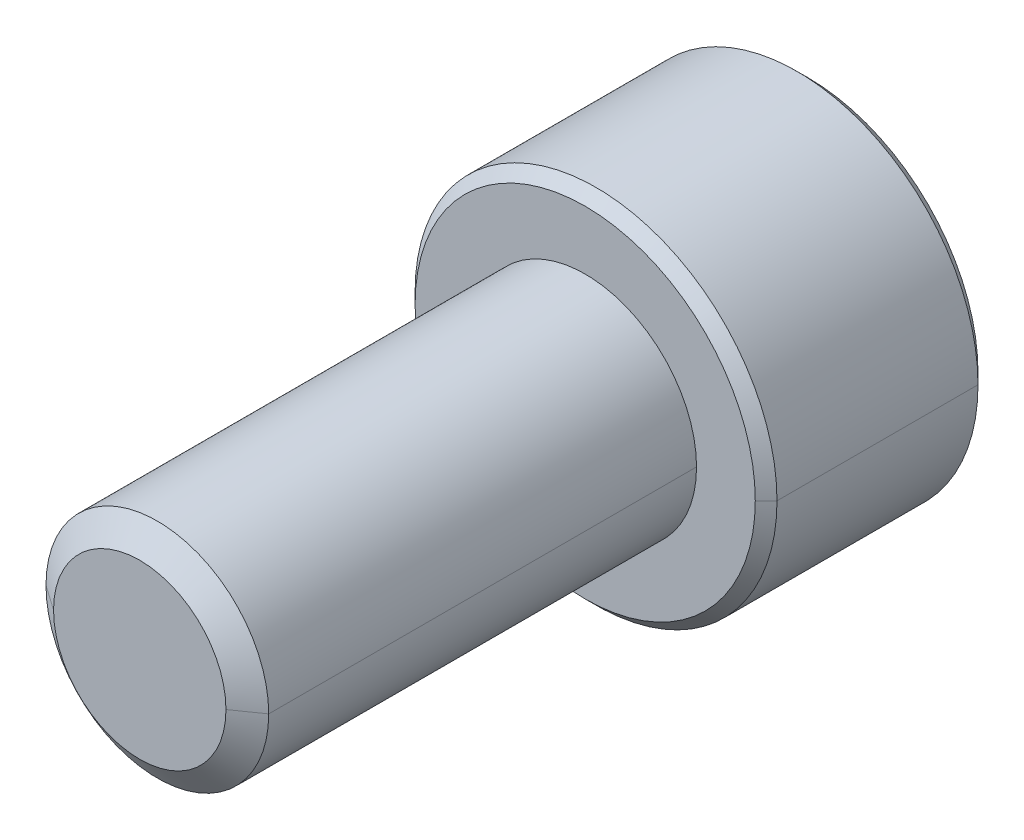
ISO-10303-21;
HEADER;
FILE_DESCRIPTION(('STEP AP214'),'2;1');
FILE_NAME('part.step','',(''),(''),'','','');
FILE_SCHEMA(('AUTOMOTIVE_DESIGN { 1 0 10303 214 1 1 1 1 }'));
ENDSEC;
DATA;
#1=APPLICATION_CONTEXT('core data for automotive mechanical design processes');
#2=APPLICATION_PROTOCOL_DEFINITION('international standard','automotive_design',2000,#1);
#3=PRODUCT_CONTEXT('',#1,'mechanical');
#4=PRODUCT('Part','Part','',(#3));
#5=PRODUCT_RELATED_PRODUCT_CATEGORY('part','',(#4));
#6=PRODUCT_DEFINITION_FORMATION('','',#4);
#7=PRODUCT_DEFINITION_CONTEXT('part definition',#1,'design');
#8=PRODUCT_DEFINITION('design','',#6,#7);
#9=PRODUCT_DEFINITION_SHAPE('','',#8);
#10=(LENGTH_UNIT() NAMED_UNIT(*) SI_UNIT(.MILLI.,.METRE.));
#11=(NAMED_UNIT(*) PLANE_ANGLE_UNIT() SI_UNIT($,.RADIAN.));
#12=(NAMED_UNIT(*) SI_UNIT($,.STERADIAN.) SOLID_ANGLE_UNIT());
#13=UNCERTAINTY_MEASURE_WITH_UNIT(LENGTH_MEASURE(1.E-05),#10,'distance_accuracy_value','');
#14=(GEOMETRIC_REPRESENTATION_CONTEXT(3) GLOBAL_UNCERTAINTY_ASSIGNED_CONTEXT((#13)) GLOBAL_UNIT_ASSIGNED_CONTEXT((#10,
#11,#12)) REPRESENTATION_CONTEXT('',''));
#15=CARTESIAN_POINT('',(0.,0.,0.));
#16=DIRECTION('',(0.,0.,1.));
#17=DIRECTION('',(1.,0.,0.));
#18=AXIS2_PLACEMENT_3D('',#15,#16,#17);
#19=CARTESIAN_POINT('',(0.,0.,-16.39));
#20=DIRECTION('',(0.,0.,-1.));
#21=DIRECTION('',(-1.,0.,0.));
#22=AXIS2_PLACEMENT_3D('',#19,#20,#21);
#23=CONICAL_SURFACE('',#22,6.5,0.785398163397445);
#24=CARTESIAN_POINT('',(0.,0.,-16.));
#25=DIRECTION('',(0.,0.,1.));
#26=DIRECTION('',(-1.,0.,0.));
#27=AXIS2_PLACEMENT_3D('',#24,#25,#26);
#28=CIRCLE('',#27,6.11);
#29=CARTESIAN_POINT('',(6.11,0.,-16.));
#30=VERTEX_POINT('',#29);
#31=CARTESIAN_POINT('',(-6.11,0.,-16.));
#32=VERTEX_POINT('',#31);
#33=EDGE_CURVE('E43',#30,#32,#28,.T.);
#34=ORIENTED_EDGE('',*,*,#33,.F.);
#35=DIRECTION('',(0.707106781186545,0.,-0.70710678118655));
#36=VECTOR('',#35,1.);
#37=CARTESIAN_POINT('',(6.5,0.,-16.39));
#38=LINE('',#37,#36);
#39=CARTESIAN_POINT('',(6.5,0.,-16.39));
#40=VERTEX_POINT('',#39);
#41=EDGE_CURVE('E11',#30,#40,#38,.T.);
#42=ORIENTED_EDGE('',*,*,#41,.T.);
#43=CARTESIAN_POINT('',(0.,0.,-16.39));
#44=DIRECTION('',(0.,0.,-1.));
#45=DIRECTION('',(-1.,0.,0.));
#46=AXIS2_PLACEMENT_3D('',#43,#44,#45);
#47=CIRCLE('',#46,6.5);
#48=CARTESIAN_POINT('',(-6.5,0.,-16.39));
#49=VERTEX_POINT('',#48);
#50=EDGE_CURVE('E602',#49,#40,#47,.T.);
#51=ORIENTED_EDGE('',*,*,#50,.F.);
#52=DIRECTION('',(-0.707106781186545,0.,-0.70710678118655));
#53=VECTOR('',#52,1.);
#54=CARTESIAN_POINT('',(-6.5,0.,-16.39));
#55=LINE('',#54,#53);
#56=EDGE_CURVE('E193',#32,#49,#55,.T.);
#57=ORIENTED_EDGE('',*,*,#56,.F.);
#58=EDGE_LOOP('',(#34,#42,#51,#57));
#59=FACE_BOUND('',#58,.T.);
#60=ADVANCED_FACE('F16',(#59),#23,.T.);
#61=CARTESIAN_POINT('',(0.,0.,-24.));
#62=DIRECTION('',(0.,0.,1.));
#63=DIRECTION('',(1.,0.,0.));
#64=AXIS2_PLACEMENT_3D('',#61,#62,#63);
#65=CONICAL_SURFACE('',#64,6.11,0.785398163397449);
#66=CARTESIAN_POINT('',(0.,0.,-24.));
#67=DIRECTION('',(0.,0.,-1.));
#68=DIRECTION('',(-1.,0.,0.));
#69=AXIS2_PLACEMENT_3D('',#66,#67,#68);
#70=CIRCLE('',#69,6.11);
#71=CARTESIAN_POINT('',(-6.11,0.,-24.));
#72=VERTEX_POINT('',#71);
#73=CARTESIAN_POINT('',(6.11,0.,-24.));
#74=VERTEX_POINT('',#73);
#75=EDGE_CURVE('E151',#72,#74,#70,.T.);
#76=ORIENTED_EDGE('',*,*,#75,.F.);
#77=DIRECTION('',(-0.707106781186548,0.,0.707106781186547));
#78=VECTOR('',#77,1.);
#79=CARTESIAN_POINT('',(-6.11,0.,-24.));
#80=LINE('',#79,#78);
#81=CARTESIAN_POINT('',(-6.5,0.,-23.61));
#82=VERTEX_POINT('',#81);
#83=EDGE_CURVE('E29',#72,#82,#80,.T.);
#84=ORIENTED_EDGE('',*,*,#83,.T.);
#85=CARTESIAN_POINT('',(0.,0.,-23.61));
#86=DIRECTION('',(0.,0.,1.));
#87=DIRECTION('',(-1.,0.,0.));
#88=AXIS2_PLACEMENT_3D('',#85,#86,#87);
#89=CIRCLE('',#88,6.5);
#90=CARTESIAN_POINT('',(6.5,0.,-23.61));
#91=VERTEX_POINT('',#90);
#92=EDGE_CURVE('E252',#91,#82,#89,.T.);
#93=ORIENTED_EDGE('',*,*,#92,.F.);
#94=DIRECTION('',(0.707106781186548,0.,0.707106781186547));
#95=VECTOR('',#94,1.);
#96=CARTESIAN_POINT('',(6.11,0.,-24.));
#97=LINE('',#96,#95);
#98=EDGE_CURVE('E156',#74,#91,#97,.T.);
#99=ORIENTED_EDGE('',*,*,#98,.F.);
#100=EDGE_LOOP('',(#76,#84,#93,#99));
#101=FACE_BOUND('',#100,.T.);
#102=ADVANCED_FACE('F153',(#101),#65,.T.);
#103=CARTESIAN_POINT('',(0.,0.,-24.));
#104=DIRECTION('',(0.,0.,-1.));
#105=DIRECTION('',(-1.,0.,0.));
#106=AXIS2_PLACEMENT_3D('',#103,#104,#105);
#107=CONICAL_SURFACE('',#106,3.46410161513775,0.78539816339745);
#108=CARTESIAN_POINT('',(-3.,0.,-23.5358983848622));
#109=CARTESIAN_POINT('',(-3.,0.436270464023545,-23.5358983848622));
#110=CARTESIAN_POINT('',(-3.,0.891919934957485,-23.6656781167882));
#111=CARTESIAN_POINT('',(-3.,1.29040025717897,-23.7791747248051));
#112=CARTESIAN_POINT('',(-3.,1.73205080756889,-24.));
#113=B_SPLINE_CURVE_WITH_KNOTS('',2,(#108,#109,#110,#111,#112),.UNSPECIFIED.,.F.,.F.,(3,2,3),
(0.,0.5,1.),.UNSPECIFIED.);
#114=CARTESIAN_POINT('',(-3.,0.,-23.5358983848623));
#115=VERTEX_POINT('',#114);
#116=CARTESIAN_POINT('',(-3.,1.73205080756888,-24.));
#117=VERTEX_POINT('',#116);
#118=EDGE_CURVE('E259',#115,#117,#113,.T.);
#119=ORIENTED_EDGE('',*,*,#118,.F.);
#120=DIRECTION('',(-0.707106781186549,0.,-0.707106781186546));
#121=VECTOR('',#120,1.);
#122=CARTESIAN_POINT('',(-3.46410161513775,0.,-24.));
#123=LINE('',#122,#121);
#124=CARTESIAN_POINT('',(-3.46410161513775,0.,-24.));
#125=VERTEX_POINT('',#124);
#126=EDGE_CURVE('E169',#115,#125,#123,.T.);
#127=ORIENTED_EDGE('',*,*,#126,.T.);
#128=CARTESIAN_POINT('',(0.,0.,-24.));
#129=DIRECTION('',(0.,0.,-1.));
#130=DIRECTION('',(-1.,0.,0.));
#131=AXIS2_PLACEMENT_3D('',#128,#129,#130);
#132=CIRCLE('',#131,3.46410161513775);
#133=EDGE_CURVE('E244',#125,#117,#132,.T.);
#134=ORIENTED_EDGE('',*,*,#133,.T.);
#135=EDGE_LOOP('',(#119,#127,#134));
#136=FACE_BOUND('',#135,.T.);
#137=ADVANCED_FACE('F231',(#136),#107,.F.);
#138=CARTESIAN_POINT('',(0.,0.,-24.));
#139=DIRECTION('',(0.,0.,1.));
#140=DIRECTION('',(1.,0.,0.));
#141=AXIS2_PLACEMENT_3D('',#138,#139,#140);
#142=CYLINDRICAL_SURFACE('',#141,6.5);
#143=ORIENTED_EDGE('',*,*,#92,.T.);
#144=DIRECTION('',(0.,0.,1.));
#145=VECTOR('',#144,1.);
#146=CARTESIAN_POINT('',(-6.5,0.,-24.));
#147=LINE('',#146,#145);
#148=EDGE_CURVE('E590',#82,#49,#147,.T.);
#149=ORIENTED_EDGE('',*,*,#148,.T.);
#150=ORIENTED_EDGE('',*,*,#50,.T.);
#151=DIRECTION('',(0.,0.,1.));
#152=VECTOR('',#151,1.);
#153=CARTESIAN_POINT('',(6.5,0.,-24.));
#154=LINE('',#153,#152);
#155=EDGE_CURVE('E182',#91,#40,#154,.T.);
#156=ORIENTED_EDGE('',*,*,#155,.F.);
#157=EDGE_LOOP('',(#143,#149,#150,#156));
#158=FACE_BOUND('',#157,.T.);
#159=ADVANCED_FACE('F235',(#158),#142,.T.);
#160=CARTESIAN_POINT('',(0.,0.,0.));
#161=DIRECTION('',(0.,0.,-1.));
#162=DIRECTION('',(-1.,0.,0.));
#163=AXIS2_PLACEMENT_3D('',#160,#161,#162);
#164=CONICAL_SURFACE('',#163,3.09648094716166,0.959931088596884);
#165=CARTESIAN_POINT('',(0.,0.,0.));
#166=DIRECTION('',(0.,0.,1.));
#167=DIRECTION('',(1.,0.,0.));
#168=AXIS2_PLACEMENT_3D('',#165,#166,#167);
#169=CIRCLE('',#168,3.09648094716166);
#170=CARTESIAN_POINT('',(3.09648094716166,0.,0.));
#171=VERTEX_POINT('',#170);
#172=CARTESIAN_POINT('',(-3.09648094716166,0.,0.));
#173=VERTEX_POINT('',#172);
#174=EDGE_CURVE('E561',#171,#173,#169,.T.);
#175=ORIENTED_EDGE('',*,*,#174,.F.);
#176=DIRECTION('',(0.819152044288994,0.,-0.573576436351044));
#177=VECTOR('',#176,1.);
#178=CARTESIAN_POINT('',(3.09648094716166,0.,0.));
#179=LINE('',#178,#177);
#180=CARTESIAN_POINT('',(4.,0.,-0.632650851713498));
#181=VERTEX_POINT('',#180);
#182=EDGE_CURVE('E606',#171,#181,#179,.T.);
#183=ORIENTED_EDGE('',*,*,#182,.T.);
#184=CARTESIAN_POINT('',(0.,0.,-0.632650851713498));
#185=DIRECTION('',(0.,0.,1.));
#186=DIRECTION('',(1.,0.,0.));
#187=AXIS2_PLACEMENT_3D('',#184,#185,#186);
#188=CIRCLE('',#187,4.);
#189=CARTESIAN_POINT('',(-4.,0.,-0.632650851713498));
#190=VERTEX_POINT('',#189);
#191=EDGE_CURVE('E553',#181,#190,#188,.T.);
#192=ORIENTED_EDGE('',*,*,#191,.T.);
#193=DIRECTION('',(-0.819152044288994,0.,-0.573576436351044));
#194=VECTOR('',#193,1.);
#195=CARTESIAN_POINT('',(-3.09648094716166,0.,0.));
#196=LINE('',#195,#194);
#197=EDGE_CURVE('E574',#173,#190,#196,.T.);
#198=ORIENTED_EDGE('',*,*,#197,.F.);
#199=EDGE_LOOP('',(#175,#183,#192,#198));
#200=FACE_BOUND('',#199,.T.);
#201=ADVANCED_FACE('F339',(#200),#164,.T.);
#202=CARTESIAN_POINT('',(0.,0.,-16.));
#203=DIRECTION('',(0.,0.,1.));
#204=DIRECTION('',(1.,0.,0.));
#205=AXIS2_PLACEMENT_3D('',#202,#203,#204);
#206=CYLINDRICAL_SURFACE('',#205,4.);
#207=CARTESIAN_POINT('',(0.,0.,-16.));
#208=DIRECTION('',(0.,0.,1.));
#209=DIRECTION('',(-1.,0.,0.));
#210=AXIS2_PLACEMENT_3D('',#207,#208,#209);
#211=CIRCLE('',#210,4.);
#212=CARTESIAN_POINT('',(4.,0.,-16.));
#213=VERTEX_POINT('',#212);
#214=CARTESIAN_POINT('',(-4.,0.,-16.));
#215=VERTEX_POINT('',#214);
#216=EDGE_CURVE('E555',#213,#215,#211,.T.);
#217=ORIENTED_EDGE('',*,*,#216,.T.);
#218=DIRECTION('',(0.,0.,1.));
#219=VECTOR('',#218,1.);
#220=CARTESIAN_POINT('',(-4.,0.,-16.));
#221=LINE('',#220,#219);
#222=EDGE_CURVE('E558',#215,#190,#221,.T.);
#223=ORIENTED_EDGE('',*,*,#222,.T.);
#224=ORIENTED_EDGE('',*,*,#191,.F.);
#225=DIRECTION('',(0.,0.,1.));
#226=VECTOR('',#225,1.);
#227=CARTESIAN_POINT('',(4.,0.,-16.));
#228=LINE('',#227,#226);
#229=EDGE_CURVE('E581',#213,#181,#228,.T.);
#230=ORIENTED_EDGE('',*,*,#229,.F.);
#231=EDGE_LOOP('',(#217,#223,#224,#230));
#232=FACE_BOUND('',#231,.T.);
#233=ADVANCED_FACE('F345',(#232),#206,.T.);
#234=CARTESIAN_POINT('',(0.,0.,-16.));
#235=DIRECTION('',(0.,0.,1.));
#236=DIRECTION('',(1.,0.,0.));
#237=AXIS2_PLACEMENT_3D('',#234,#235,#236);
#238=CYLINDRICAL_SURFACE('',#237,4.);
#239=ORIENTED_EDGE('',*,*,#222,.F.);
#240=CARTESIAN_POINT('',(0.,0.,-16.));
#241=DIRECTION('',(0.,0.,1.));
#242=DIRECTION('',(-1.,0.,0.));
#243=AXIS2_PLACEMENT_3D('',#240,#241,#242);
#244=CIRCLE('',#243,4.);
#245=EDGE_CURVE('E587',#215,#213,#244,.T.);
#246=ORIENTED_EDGE('',*,*,#245,.T.);
#247=ORIENTED_EDGE('',*,*,#229,.T.);
#248=CARTESIAN_POINT('',(0.,0.,-0.632650851713498));
#249=DIRECTION('',(0.,0.,1.));
#250=DIRECTION('',(1.,0.,0.));
#251=AXIS2_PLACEMENT_3D('',#248,#249,#250);
#252=CIRCLE('',#251,4.);
#253=EDGE_CURVE('E567',#190,#181,#252,.T.);
#254=ORIENTED_EDGE('',*,*,#253,.F.);
#255=EDGE_LOOP('',(#239,#246,#247,#254));
#256=FACE_BOUND('',#255,.T.);
#257=ADVANCED_FACE('F350',(#256),#238,.T.);
#258=CARTESIAN_POINT('',(0.,0.,0.));
#259=DIRECTION('',(0.,0.,-1.));
#260=DIRECTION('',(-1.,0.,0.));
#261=AXIS2_PLACEMENT_3D('',#258,#259,#260);
#262=CONICAL_SURFACE('',#261,3.09648094716166,0.959931088596884);
#263=ORIENTED_EDGE('',*,*,#182,.F.);
#264=CARTESIAN_POINT('',(0.,0.,0.));
#265=DIRECTION('',(0.,0.,1.));
#266=DIRECTION('',(1.,0.,0.));
#267=AXIS2_PLACEMENT_3D('',#264,#265,#266);
#268=CIRCLE('',#267,3.09648094716166);
#269=EDGE_CURVE('E563',#173,#171,#268,.T.);
#270=ORIENTED_EDGE('',*,*,#269,.F.);
#271=ORIENTED_EDGE('',*,*,#197,.T.);
#272=ORIENTED_EDGE('',*,*,#253,.T.);
#273=EDGE_LOOP('',(#263,#270,#271,#272));
#274=FACE_BOUND('',#273,.T.);
#275=ADVANCED_FACE('F347',(#274),#262,.T.);
#276=CARTESIAN_POINT('',(0.,0.,0.));
#277=DIRECTION('',(0.,0.,1.));
#278=DIRECTION('',(1.,0.,0.));
#279=AXIS2_PLACEMENT_3D('',#276,#277,#278);
#280=PLANE('',#279);
#281=ORIENTED_EDGE('',*,*,#269,.T.);
#282=ORIENTED_EDGE('',*,*,#174,.T.);
#283=EDGE_LOOP('',(#281,#282));
#284=FACE_BOUND('',#283,.T.);
#285=ADVANCED_FACE('F18',(#284),#280,.T.);
#286=CARTESIAN_POINT('',(0.,0.,-24.));
#287=DIRECTION('',(0.,0.,1.));
#288=DIRECTION('',(1.,0.,0.));
#289=AXIS2_PLACEMENT_3D('',#286,#287,#288);
#290=CYLINDRICAL_SURFACE('',#289,6.5);
#291=ORIENTED_EDGE('',*,*,#148,.F.);
#292=CARTESIAN_POINT('',(0.,0.,-23.61));
#293=DIRECTION('',(0.,0.,1.));
#294=DIRECTION('',(-1.,0.,0.));
#295=AXIS2_PLACEMENT_3D('',#292,#293,#294);
#296=CIRCLE('',#295,6.5);
#297=EDGE_CURVE('E167',#82,#91,#296,.T.);
#298=ORIENTED_EDGE('',*,*,#297,.T.);
#299=ORIENTED_EDGE('',*,*,#155,.T.);
#300=CARTESIAN_POINT('',(0.,0.,-16.39));
#301=DIRECTION('',(0.,0.,-1.));
#302=DIRECTION('',(-1.,0.,0.));
#303=AXIS2_PLACEMENT_3D('',#300,#301,#302);
#304=CIRCLE('',#303,6.5);
#305=EDGE_CURVE('E174',#40,#49,#304,.T.);
#306=ORIENTED_EDGE('',*,*,#305,.T.);
#307=EDGE_LOOP('',(#291,#298,#299,#306));
#308=FACE_BOUND('',#307,.T.);
#309=ADVANCED_FACE('F352',(#308),#290,.T.);
#310=CARTESIAN_POINT('',(0.,0.,-24.));
#311=DIRECTION('',(0.,0.,-1.));
#312=DIRECTION('',(0.,-1.,0.));
#313=AXIS2_PLACEMENT_3D('',#310,#311,#312);
#314=PLANE('',#313);
#315=CARTESIAN_POINT('',(0.,0.,-24.));
#316=DIRECTION('',(0.,0.,-1.));
#317=DIRECTION('',(-1.,0.,0.));
#318=AXIS2_PLACEMENT_3D('',#315,#316,#317);
#319=CIRCLE('',#318,6.11);
#320=EDGE_CURVE('E161',#74,#72,#319,.T.);
#321=ORIENTED_EDGE('',*,*,#320,.T.);
#322=ORIENTED_EDGE('',*,*,#75,.T.);
#323=EDGE_LOOP('',(#321,#322));
#324=FACE_BOUND('',#323,.T.);
#325=CARTESIAN_POINT('',(0.,0.,-24.));
#326=DIRECTION('',(0.,0.,-1.));
#327=DIRECTION('',(-1.,0.,0.));
#328=AXIS2_PLACEMENT_3D('',#325,#326,#327);
#329=CIRCLE('',#328,3.46410161513775);
#330=CARTESIAN_POINT('',(0.,3.46410161513775,-24.));
#331=VERTEX_POINT('',#330);
#332=EDGE_CURVE('E436',#117,#331,#329,.T.);
#333=ORIENTED_EDGE('',*,*,#332,.F.);
#334=ORIENTED_EDGE('',*,*,#133,.F.);
#335=CARTESIAN_POINT('',(0.,0.,-24.));
#336=DIRECTION('',(0.,0.,-1.));
#337=DIRECTION('',(-1.,0.,0.));
#338=AXIS2_PLACEMENT_3D('',#335,#336,#337);
#339=CIRCLE('',#338,3.46410161513775);
#340=CARTESIAN_POINT('',(-3.,-1.73205080756888,-24.));
#341=VERTEX_POINT('',#340);
#342=EDGE_CURVE('E308',#341,#125,#339,.T.);
#343=ORIENTED_EDGE('',*,*,#342,.F.);
#344=CARTESIAN_POINT('',(0.,0.,-24.));
#345=DIRECTION('',(0.,0.,-1.));
#346=DIRECTION('',(-1.,0.,0.));
#347=AXIS2_PLACEMENT_3D('',#344,#345,#346);
#348=CIRCLE('',#347,3.46410161513775);
#349=CARTESIAN_POINT('',(0.,-3.46410161513775,-24.));
#350=VERTEX_POINT('',#349);
#351=EDGE_CURVE('E298',#350,#341,#348,.T.);
#352=ORIENTED_EDGE('',*,*,#351,.F.);
#353=CARTESIAN_POINT('',(0.,0.,-24.));
#354=DIRECTION('',(0.,0.,-1.));
#355=DIRECTION('',(-1.,0.,0.));
#356=AXIS2_PLACEMENT_3D('',#353,#354,#355);
#357=CIRCLE('',#356,3.46410161513775);
#358=CARTESIAN_POINT('',(3.,-1.73205080756888,-24.));
#359=VERTEX_POINT('',#358);
#360=EDGE_CURVE('E307',#359,#350,#357,.T.);
#361=ORIENTED_EDGE('',*,*,#360,.F.);
#362=CARTESIAN_POINT('',(0.,0.,-24.));
#363=DIRECTION('',(0.,0.,-1.));
#364=DIRECTION('',(-1.,0.,0.));
#365=AXIS2_PLACEMENT_3D('',#362,#363,#364);
#366=CIRCLE('',#365,3.46410161513775);
#367=CARTESIAN_POINT('',(3.,1.73205080756888,-24.));
#368=VERTEX_POINT('',#367);
#369=EDGE_CURVE('E462',#368,#359,#366,.T.);
#370=ORIENTED_EDGE('',*,*,#369,.F.);
#371=CARTESIAN_POINT('',(0.,0.,-24.));
#372=DIRECTION('',(0.,0.,-1.));
#373=DIRECTION('',(-1.,0.,0.));
#374=AXIS2_PLACEMENT_3D('',#371,#372,#373);
#375=CIRCLE('',#374,3.46410161513775);
#376=EDGE_CURVE('E198',#331,#368,#375,.T.);
#377=ORIENTED_EDGE('',*,*,#376,.F.);
#378=EDGE_LOOP('',(#333,#334,#343,#352,#361,#370,#377));
#379=FACE_BOUND('',#378,.T.);
#380=ADVANCED_FACE('F171',(#324,#379),#314,.T.);
#381=CARTESIAN_POINT('',(0.,0.,-16.));
#382=DIRECTION('',(0.,0.,-1.));
#383=DIRECTION('',(0.,-1.,0.));
#384=AXIS2_PLACEMENT_3D('',#381,#382,#383);
#385=PLANE('',#384);
#386=CARTESIAN_POINT('',(0.,0.,-16.));
#387=DIRECTION('',(0.,0.,1.));
#388=DIRECTION('',(-1.,0.,0.));
#389=AXIS2_PLACEMENT_3D('',#386,#387,#388);
#390=CIRCLE('',#389,6.11);
#391=EDGE_CURVE('E162',#32,#30,#390,.T.);
#392=ORIENTED_EDGE('',*,*,#391,.T.);
#393=ORIENTED_EDGE('',*,*,#33,.T.);
#394=EDGE_LOOP('',(#392,#393));
#395=FACE_BOUND('',#394,.T.);
#396=ORIENTED_EDGE('',*,*,#216,.F.);
#397=ORIENTED_EDGE('',*,*,#245,.F.);
#398=EDGE_LOOP('',(#396,#397));
#399=FACE_BOUND('',#398,.T.);
#400=ADVANCED_FACE('F362',(#395,#399),#385,.F.);
#401=CARTESIAN_POINT('',(0.,0.,-24.));
#402=DIRECTION('',(0.,0.,-1.));
#403=DIRECTION('',(-1.,0.,0.));
#404=AXIS2_PLACEMENT_3D('',#401,#402,#403);
#405=CONICAL_SURFACE('',#404,3.46410161513775,0.78539816339745);
#406=ORIENTED_EDGE('',*,*,#376,.T.);
#407=CARTESIAN_POINT('',(0.,3.46410161513775,-24.));
#408=CARTESIAN_POINT('',(0.379142767268083,3.24520343639423,-23.7811018212565));
#409=CARTESIAN_POINT('',(0.722338134297864,3.04705949885495,-23.6674066428464));
#410=CARTESIAN_POINT('',(1.11623432832392,2.81964342520124,-23.5369150851007));
#411=CARTESIAN_POINT('',(1.4944765536544,2.6012651745878,-23.5359051645123));
#412=CARTESIAN_POINT('',(1.87249987526982,2.38301330809318,-23.5348958284048));
#413=CARTESIAN_POINT('',(2.26762283352277,2.15488896178285,-23.6641023028841));
#414=CARTESIAN_POINT('',(2.61490255117932,1.95438692330974,-23.7776638842587));
#415=CARTESIAN_POINT('',(3.,1.73205080756888,-24.));
#416=B_SPLINE_CURVE_WITH_KNOTS('',2,(#407,#408,#409,#410,#411,#412,#413,#414,#415),
.UNSPECIFIED.,.F.,.F.,(3,2,2,2,3),(0.,0.25,0.5,0.75,1.),.UNSPECIFIED.);
#417=EDGE_CURVE('E205',#331,#368,#416,.T.);
#418=ORIENTED_EDGE('',*,*,#417,.F.);
#419=EDGE_LOOP('',(#406,#418));
#420=FACE_BOUND('',#419,.T.);
#421=ADVANCED_FACE('F224',(#420),#405,.F.);
#422=CARTESIAN_POINT('',(0.,0.,-24.));
#423=DIRECTION('',(0.,0.,-1.));
#424=DIRECTION('',(-1.,0.,0.));
#425=AXIS2_PLACEMENT_3D('',#422,#423,#424);
#426=CONICAL_SURFACE('',#425,3.46410161513775,0.78539816339745);
#427=ORIENTED_EDGE('',*,*,#369,.T.);
#428=CARTESIAN_POINT('',(3.,1.73205080756888,-24.));
#429=CARTESIAN_POINT('',(3.,1.2910241366598,-23.7794866645455));
#430=CARTESIAN_POINT('',(3.,0.892009778202151,-23.6657037213661));
#431=CARTESIAN_POINT('',(3.,0.437187687637575,-23.5360066440794));
#432=CARTESIAN_POINT('',(3.,0.000188842588823941,-23.5358983908058));
#433=CARTESIAN_POINT('',(3.,-0.435758902234911,-23.5357903979107));
#434=CARTESIAN_POINT('',(3.,-0.891638370544821,-23.665597888621));
#435=CARTESIAN_POINT('',(3.,-1.29024671134656,-23.7790979518888));
#436=CARTESIAN_POINT('',(3.,-1.73205080756889,-24.));
#437=B_SPLINE_CURVE_WITH_KNOTS('',2,(#428,#429,#430,#431,#432,#433,#434,#435,#436),
.UNSPECIFIED.,.F.,.F.,(3,2,2,2,3),(0.,0.25,0.5,0.75,1.),.UNSPECIFIED.);
#438=EDGE_CURVE('E488',#368,#359,#437,.T.);
#439=ORIENTED_EDGE('',*,*,#438,.F.);
#440=EDGE_LOOP('',(#427,#439));
#441=FACE_BOUND('',#440,.T.);
#442=ADVANCED_FACE('F287',(#441),#426,.F.);
#443=CARTESIAN_POINT('',(0.,0.,-24.));
#444=DIRECTION('',(0.,0.,-1.));
#445=DIRECTION('',(-1.,0.,0.));
#446=AXIS2_PLACEMENT_3D('',#443,#444,#445);
#447=CONICAL_SURFACE('',#446,3.46410161513775,0.78539816339745);
#448=ORIENTED_EDGE('',*,*,#360,.T.);
#449=CARTESIAN_POINT('',(3.,-1.73205080756888,-24.));
#450=CARTESIAN_POINT('',(2.62085723273702,-1.95094898630946,-23.7811018212594));
#451=CARTESIAN_POINT('',(2.27766186570213,-2.14909292385168,-23.6674066428464));
#452=CARTESIAN_POINT('',(1.8837656716933,-2.37650899749546,-23.536915085105));
#453=CARTESIAN_POINT('',(1.5055234463456,-2.59488724811883,-23.5359051645123));
#454=CARTESIAN_POINT('',(1.12750012475197,-2.81313911460087,-23.5348958284006));
#455=CARTESIAN_POINT('',(0.732377166477235,-3.04126346092379,-23.6641023028841));
#456=CARTESIAN_POINT('',(0.385097448831145,-3.24176549939086,-23.7776638842526));
#457=CARTESIAN_POINT('',(0.,-3.46410161513776,-24.));
#458=B_SPLINE_CURVE_WITH_KNOTS('',2,(#449,#450,#451,#452,#453,#454,#455,#456,#457),
.UNSPECIFIED.,.F.,.F.,(3,2,2,2,3),(0.,0.25,0.5,0.75,1.),.UNSPECIFIED.);
#459=EDGE_CURVE('E315',#359,#350,#458,.T.);
#460=ORIENTED_EDGE('',*,*,#459,.F.);
#461=EDGE_LOOP('',(#448,#460));
#462=FACE_BOUND('',#461,.T.);
#463=ADVANCED_FACE('F282',(#462),#447,.F.);
#464=CARTESIAN_POINT('',(0.,0.,-24.));
#465=DIRECTION('',(0.,0.,-1.));
#466=DIRECTION('',(-1.,0.,0.));
#467=AXIS2_PLACEMENT_3D('',#464,#465,#466);
#468=CONICAL_SURFACE('',#467,3.46410161513775,0.78539816339745);
#469=ORIENTED_EDGE('',*,*,#351,.T.);
#470=CARTESIAN_POINT('',(0.,-3.46410161513775,-24.));
#471=CARTESIAN_POINT('',(-0.379142767263104,-3.2452034363971,-23.7811018212594));
#472=CARTESIAN_POINT('',(-0.722338134297864,-3.04705949885495,-23.6674066428464));
#473=CARTESIAN_POINT('',(-1.11623432830685,-2.81964342521109,-23.536915085105));
#474=CARTESIAN_POINT('',(-1.4944765536544,-2.6012651745878,-23.5359051645123));
#475=CARTESIAN_POINT('',(-1.8724998752575,-2.38301330810029,-23.5348958284006));
#476=CARTESIAN_POINT('',(-2.26762283352276,-2.15488896178285,-23.6641023028841));
#477=CARTESIAN_POINT('',(-2.61490255117987,-1.95438692330941,-23.777663884259));
#478=CARTESIAN_POINT('',(-3.,-1.73205080756888,-24.));
#479=B_SPLINE_CURVE_WITH_KNOTS('',2,(#470,#471,#472,#473,#474,#475,#476,#477,#478),
.UNSPECIFIED.,.F.,.F.,(3,2,2,2,3),(0.,0.25,0.5,0.75,1.),.UNSPECIFIED.);
#480=EDGE_CURVE('E316',#350,#341,#479,.T.);
#481=ORIENTED_EDGE('',*,*,#480,.F.);
#482=EDGE_LOOP('',(#469,#481));
#483=FACE_BOUND('',#482,.T.);
#484=ADVANCED_FACE('F286',(#483),#468,.F.);
#485=CARTESIAN_POINT('',(0.,0.,-24.));
#486=DIRECTION('',(0.,0.,-1.));
#487=DIRECTION('',(-1.,0.,0.));
#488=AXIS2_PLACEMENT_3D('',#485,#486,#487);
#489=CONICAL_SURFACE('',#488,3.46410161513775,0.78539816339745);
#490=ORIENTED_EDGE('',*,*,#126,.F.);
#491=CARTESIAN_POINT('',(-3.,-1.73205080756888,-24.));
#492=CARTESIAN_POINT('',(-3.,-1.29086873361204,-23.7794089630216));
#493=CARTESIAN_POINT('',(-3.,-0.89172798683031,-23.6656234211069));
#494=CARTESIAN_POINT('',(-3.,-0.436674146318746,-23.5358983848622));
#495=CARTESIAN_POINT('',(-3.,0.,-23.5358983848622));
#496=B_SPLINE_CURVE_WITH_KNOTS('',2,(#491,#492,#493,#494,#495),.UNSPECIFIED.,.F.,.F.,(3,2,3),
(0.,0.5,1.),.UNSPECIFIED.);
#497=EDGE_CURVE('E426',#341,#115,#496,.T.);
#498=ORIENTED_EDGE('',*,*,#497,.F.);
#499=ORIENTED_EDGE('',*,*,#342,.T.);
#500=EDGE_LOOP('',(#490,#498,#499));
#501=FACE_BOUND('',#500,.T.);
#502=ADVANCED_FACE('F380',(#501),#489,.F.);
#503=CARTESIAN_POINT('',(0.,0.,-24.));
#504=DIRECTION('',(0.,0.,-1.));
#505=DIRECTION('',(-1.,0.,0.));
#506=AXIS2_PLACEMENT_3D('',#503,#504,#505);
#507=CONICAL_SURFACE('',#506,3.46410161513775,0.78539816339745);
#508=ORIENTED_EDGE('',*,*,#332,.T.);
#509=CARTESIAN_POINT('',(-3.,1.73205080756888,-24.));
#510=CARTESIAN_POINT('',(-2.62085723274783,1.95094898630322,-23.7811018212657));
#511=CARTESIAN_POINT('',(-2.27766186570213,2.14909292385168,-23.6674066428464));
#512=CARTESIAN_POINT('',(-1.88376567170685,2.37650899748763,-23.5369150851064));
#513=CARTESIAN_POINT('',(-1.5055234463456,2.59488724811883,-23.5359051645123));
#514=CARTESIAN_POINT('',(-1.12750012475178,2.81313911460098,-23.5348958283992));
#515=CARTESIAN_POINT('',(-0.732377166477235,3.04126346092379,-23.6641023028841));
#516=CARTESIAN_POINT('',(-0.385097448826009,3.24176549939382,-23.7776638842556));
#517=CARTESIAN_POINT('',(0.,3.46410161513775,-24.));
#518=B_SPLINE_CURVE_WITH_KNOTS('',2,(#509,#510,#511,#512,#513,#514,#515,#516,#517),
.UNSPECIFIED.,.F.,.F.,(3,2,2,2,3),(0.,0.25,0.5,0.75,1.),.UNSPECIFIED.);
#519=EDGE_CURVE('E260',#117,#331,#518,.T.);
#520=ORIENTED_EDGE('',*,*,#519,.F.);
#521=EDGE_LOOP('',(#508,#520));
#522=FACE_BOUND('',#521,.T.);
#523=ADVANCED_FACE('F383',(#522),#507,.F.);
#524=CARTESIAN_POINT('',(3.,5.19615242270663,-19.5));
#525=DIRECTION('',(0.,0.,-1.));
#526=DIRECTION('',(0.,-1.,0.));
#527=AXIS2_PLACEMENT_3D('',#524,#525,#526);
#528=PLANE('',#527);
#529=DIRECTION('',(0.866025403784439,0.5,0.));
#530=VECTOR('',#529,1.);
#531=CARTESIAN_POINT('',(-3.,1.73205080756888,-19.5));
#532=LINE('',#531,#530);
#533=CARTESIAN_POINT('',(-3.,1.73205080756888,-19.5));
#534=VERTEX_POINT('',#533);
#535=CARTESIAN_POINT('',(0.,3.46410161513775,-19.5));
#536=VERTEX_POINT('',#535);
#537=EDGE_CURVE('E457',#534,#536,#532,.T.);
#538=ORIENTED_EDGE('',*,*,#537,.T.);
#539=DIRECTION('',(0.866025403784439,-0.5,0.));
#540=VECTOR('',#539,1.);
#541=CARTESIAN_POINT('',(0.,3.46410161513775,-19.5));
#542=LINE('',#541,#540);
#543=CARTESIAN_POINT('',(3.,1.73205080756888,-19.5));
#544=VERTEX_POINT('',#543);
#545=EDGE_CURVE('E467',#536,#544,#542,.T.);
#546=ORIENTED_EDGE('',*,*,#545,.T.);
#547=DIRECTION('',(0.,-1.,0.));
#548=VECTOR('',#547,1.);
#549=CARTESIAN_POINT('',(3.,1.73205080756888,-19.5));
#550=LINE('',#549,#548);
#551=CARTESIAN_POINT('',(3.,-1.73205080756888,-19.5));
#552=VERTEX_POINT('',#551);
#553=EDGE_CURVE('E542',#544,#552,#550,.T.);
#554=ORIENTED_EDGE('',*,*,#553,.T.);
#555=DIRECTION('',(-0.866025403784438,-0.5,0.));
#556=VECTOR('',#555,1.);
#557=CARTESIAN_POINT('',(3.,-1.73205080756888,-19.5));
#558=LINE('',#557,#556);
#559=CARTESIAN_POINT('',(0.,-3.46410161513775,-19.5));
#560=VERTEX_POINT('',#559);
#561=EDGE_CURVE('E539',#552,#560,#558,.T.);
#562=ORIENTED_EDGE('',*,*,#561,.T.);
#563=DIRECTION('',(-0.866025403784439,0.5,0.));
#564=VECTOR('',#563,1.);
#565=CARTESIAN_POINT('',(0.,-3.46410161513775,-19.5));
#566=LINE('',#565,#564);
#567=CARTESIAN_POINT('',(-3.,-1.73205080756888,-19.5));
#568=VERTEX_POINT('',#567);
#569=EDGE_CURVE('E190',#560,#568,#566,.T.);
#570=ORIENTED_EDGE('',*,*,#569,.T.);
#571=DIRECTION('',(0.,1.,0.));
#572=VECTOR('',#571,1.);
#573=CARTESIAN_POINT('',(-3.,-1.73205080756888,-19.5));
#574=LINE('',#573,#572);
#575=EDGE_CURVE('E188',#568,#534,#574,.T.);
#576=ORIENTED_EDGE('',*,*,#575,.T.);
#577=EDGE_LOOP('',(#538,#546,#554,#562,#570,#576));
#578=FACE_BOUND('',#577,.T.);
#579=ADVANCED_FACE('F223',(#578),#528,.T.);
#580=CARTESIAN_POINT('',(0.,3.46410161513775,-19.5));
#581=DIRECTION('',(0.5,0.866025403784439,0.));
#582=DIRECTION('',(0.,0.,-1.));
#583=AXIS2_PLACEMENT_3D('',#580,#581,#582);
#584=PLANE('',#583);
#585=DIRECTION('',(0.,0.,-1.));
#586=VECTOR('',#585,1.);
#587=CARTESIAN_POINT('',(0.,3.46410161513775,-19.5));
#588=LINE('',#587,#586);
#589=EDGE_CURVE('E191',#536,#331,#588,.T.);
#590=ORIENTED_EDGE('',*,*,#589,.T.);
#591=ORIENTED_EDGE('',*,*,#417,.T.);
#592=DIRECTION('',(0.,0.,-1.));
#593=VECTOR('',#592,1.);
#594=CARTESIAN_POINT('',(3.,1.73205080756888,-19.5));
#595=LINE('',#594,#593);
#596=EDGE_CURVE('E476',#544,#368,#595,.T.);
#597=ORIENTED_EDGE('',*,*,#596,.F.);
#598=ORIENTED_EDGE('',*,*,#545,.F.);
#599=EDGE_LOOP('',(#590,#591,#597,#598));
#600=FACE_BOUND('',#599,.T.);
#601=ADVANCED_FACE('F212',(#600),#584,.F.);
#602=CARTESIAN_POINT('',(3.,1.73205080756888,-19.5));
#603=DIRECTION('',(1.,0.,0.));
#604=DIRECTION('',(0.,1.,0.));
#605=AXIS2_PLACEMENT_3D('',#602,#603,#604);
#606=PLANE('',#605);
#607=ORIENTED_EDGE('',*,*,#596,.T.);
#608=ORIENTED_EDGE('',*,*,#438,.T.);
#609=DIRECTION('',(0.,0.,-1.));
#610=VECTOR('',#609,1.);
#611=CARTESIAN_POINT('',(3.,-1.73205080756888,-19.5));
#612=LINE('',#611,#610);
#613=EDGE_CURVE('E518',#552,#359,#612,.T.);
#614=ORIENTED_EDGE('',*,*,#613,.F.);
#615=ORIENTED_EDGE('',*,*,#553,.F.);
#616=EDGE_LOOP('',(#607,#608,#614,#615));
#617=FACE_BOUND('',#616,.T.);
#618=ADVANCED_FACE('F222',(#617),#606,.F.);
#619=CARTESIAN_POINT('',(3.,-1.73205080756888,-19.5));
#620=DIRECTION('',(0.5,-0.866025403784439,0.));
#621=DIRECTION('',(0.,0.,-1.));
#622=AXIS2_PLACEMENT_3D('',#619,#620,#621);
#623=PLANE('',#622);
#624=ORIENTED_EDGE('',*,*,#613,.T.);
#625=ORIENTED_EDGE('',*,*,#459,.T.);
#626=DIRECTION('',(0.,0.,-1.));
#627=VECTOR('',#626,1.);
#628=CARTESIAN_POINT('',(0.,-3.46410161513775,-19.5));
#629=LINE('',#628,#627);
#630=EDGE_CURVE('E311',#560,#350,#629,.T.);
#631=ORIENTED_EDGE('',*,*,#630,.F.);
#632=ORIENTED_EDGE('',*,*,#561,.F.);
#633=EDGE_LOOP('',(#624,#625,#631,#632));
#634=FACE_BOUND('',#633,.T.);
#635=ADVANCED_FACE('F289',(#634),#623,.F.);
#636=CARTESIAN_POINT('',(0.,-3.46410161513775,-19.5));
#637=DIRECTION('',(-0.5,-0.866025403784439,0.));
#638=DIRECTION('',(-0.866025403784439,0.5,0.));
#639=AXIS2_PLACEMENT_3D('',#636,#637,#638);
#640=PLANE('',#639);
#641=ORIENTED_EDGE('',*,*,#630,.T.);
#642=ORIENTED_EDGE('',*,*,#480,.T.);
#643=DIRECTION('',(0.,0.,-1.));
#644=VECTOR('',#643,1.);
#645=CARTESIAN_POINT('',(-3.,-1.73205080756888,-19.5));
#646=LINE('',#645,#644);
#647=EDGE_CURVE('E429',#568,#341,#646,.T.);
#648=ORIENTED_EDGE('',*,*,#647,.F.);
#649=ORIENTED_EDGE('',*,*,#569,.F.);
#650=EDGE_LOOP('',(#641,#642,#648,#649));
#651=FACE_BOUND('',#650,.T.);
#652=ADVANCED_FACE('F328',(#651),#640,.F.);
#653=CARTESIAN_POINT('',(-3.,-1.73205080756888,-19.5));
#654=DIRECTION('',(-1.,0.,0.));
#655=DIRECTION('',(0.,0.,1.));
#656=AXIS2_PLACEMENT_3D('',#653,#654,#655);
#657=PLANE('',#656);
#658=ORIENTED_EDGE('',*,*,#647,.T.);
#659=ORIENTED_EDGE('',*,*,#497,.T.);
#660=ORIENTED_EDGE('',*,*,#118,.T.);
#661=DIRECTION('',(0.,0.,-1.));
#662=VECTOR('',#661,1.);
#663=CARTESIAN_POINT('',(-3.,1.73205080756888,-19.5));
#664=LINE('',#663,#662);
#665=EDGE_CURVE('E255',#534,#117,#664,.T.);
#666=ORIENTED_EDGE('',*,*,#665,.F.);
#667=ORIENTED_EDGE('',*,*,#575,.F.);
#668=EDGE_LOOP('',(#658,#659,#660,#666,#667));
#669=FACE_BOUND('',#668,.T.);
#670=ADVANCED_FACE('F278',(#669),#657,.F.);
#671=CARTESIAN_POINT('',(-3.,1.73205080756888,-19.5));
#672=DIRECTION('',(-0.5,0.866025403784439,0.));
#673=DIRECTION('',(0.,0.,1.));
#674=AXIS2_PLACEMENT_3D('',#671,#672,#673);
#675=PLANE('',#674);
#676=ORIENTED_EDGE('',*,*,#665,.T.);
#677=ORIENTED_EDGE('',*,*,#519,.T.);
#678=ORIENTED_EDGE('',*,*,#589,.F.);
#679=ORIENTED_EDGE('',*,*,#537,.F.);
#680=EDGE_LOOP('',(#676,#677,#678,#679));
#681=FACE_BOUND('',#680,.T.);
#682=ADVANCED_FACE('F230',(#681),#675,.F.);
#683=CARTESIAN_POINT('',(0.,0.,-24.));
#684=DIRECTION('',(0.,0.,1.));
#685=DIRECTION('',(1.,0.,0.));
#686=AXIS2_PLACEMENT_3D('',#683,#684,#685);
#687=CONICAL_SURFACE('',#686,6.11,0.785398163397449);
#688=ORIENTED_EDGE('',*,*,#83,.F.);
#689=ORIENTED_EDGE('',*,*,#320,.F.);
#690=ORIENTED_EDGE('',*,*,#98,.T.);
#691=ORIENTED_EDGE('',*,*,#297,.F.);
#692=EDGE_LOOP('',(#688,#689,#690,#691));
#693=FACE_BOUND('',#692,.T.);
#694=ADVANCED_FACE('F165',(#693),#687,.T.);
#695=CARTESIAN_POINT('',(0.,0.,-16.39));
#696=DIRECTION('',(0.,0.,-1.));
#697=DIRECTION('',(-1.,0.,0.));
#698=AXIS2_PLACEMENT_3D('',#695,#696,#697);
#699=CONICAL_SURFACE('',#698,6.5,0.785398163397445);
#700=ORIENTED_EDGE('',*,*,#41,.F.);
#701=ORIENTED_EDGE('',*,*,#391,.F.);
#702=ORIENTED_EDGE('',*,*,#56,.T.);
#703=ORIENTED_EDGE('',*,*,#305,.F.);
#704=EDGE_LOOP('',(#700,#701,#702,#703));
#705=FACE_BOUND('',#704,.T.);
#706=ADVANCED_FACE('F229',(#705),#699,.T.);
#707=CLOSED_SHELL('',(#60,#102,#137,#159,#201,#233,#257,#275,#285,#309,#380,#400,#421,#442,#463,
#484,#502,#523,#579,#601,#618,#635,#652,#670,#682,#694,#706));
#708=MANIFOLD_SOLID_BREP('B1',#707);
#709=ADVANCED_BREP_SHAPE_REPRESENTATION('',(#18,#708),#14);
#710=SHAPE_DEFINITION_REPRESENTATION(#9,#709);
ENDSEC;
END-ISO-10303-21;
